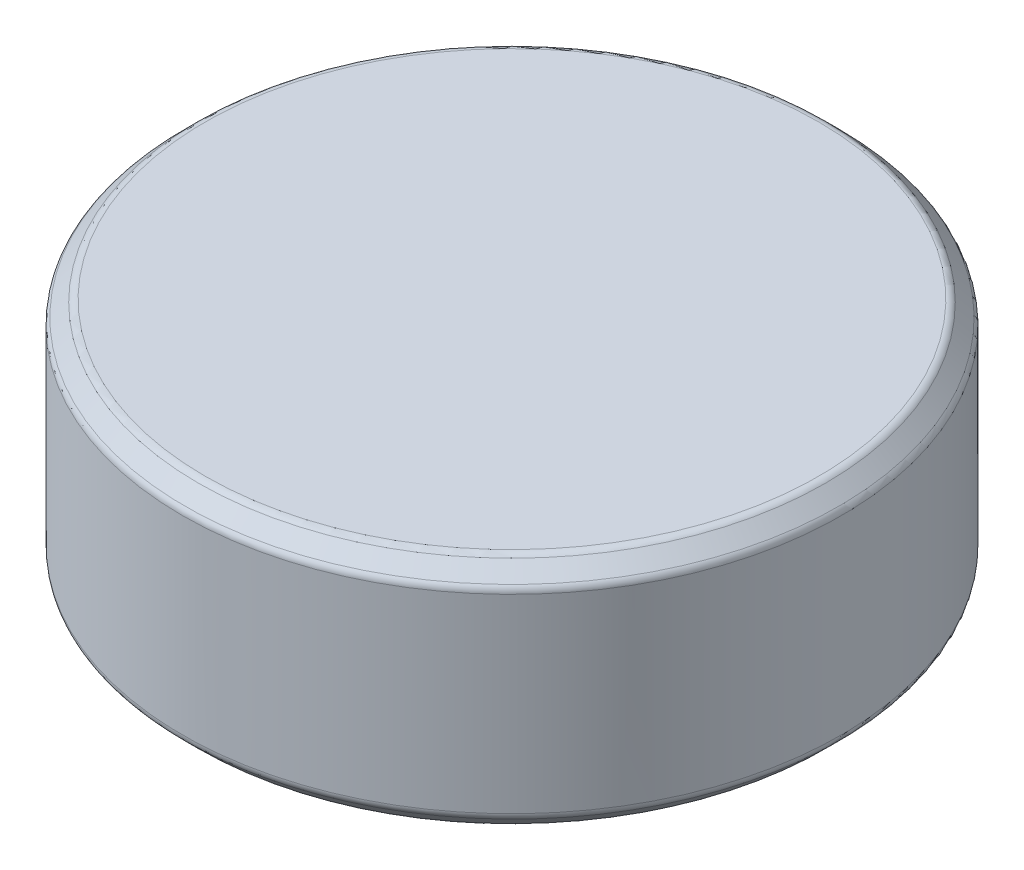
ISO-10303-21;
HEADER;
FILE_DESCRIPTION(('STEP AP214'),'2;1');
FILE_NAME('part.step','',(''),(''),'','','');
FILE_SCHEMA(('AUTOMOTIVE_DESIGN { 1 0 10303 214 1 1 1 1 }'));
ENDSEC;
DATA;
#1=APPLICATION_CONTEXT('core data for automotive mechanical design processes');
#2=APPLICATION_PROTOCOL_DEFINITION('international standard','automotive_design',2000,#1);
#3=PRODUCT_CONTEXT('',#1,'mechanical');
#4=PRODUCT('Part','Part','',(#3));
#5=PRODUCT_RELATED_PRODUCT_CATEGORY('part','',(#4));
#6=PRODUCT_DEFINITION_FORMATION('','',#4);
#7=PRODUCT_DEFINITION_CONTEXT('part definition',#1,'design');
#8=PRODUCT_DEFINITION('design','',#6,#7);
#9=PRODUCT_DEFINITION_SHAPE('','',#8);
#10=(LENGTH_UNIT() NAMED_UNIT(*) SI_UNIT(.MILLI.,.METRE.));
#11=(NAMED_UNIT(*) PLANE_ANGLE_UNIT() SI_UNIT($,.RADIAN.));
#12=(NAMED_UNIT(*) SI_UNIT($,.STERADIAN.) SOLID_ANGLE_UNIT());
#13=UNCERTAINTY_MEASURE_WITH_UNIT(LENGTH_MEASURE(1.E-05),#10,'distance_accuracy_value','');
#14=(GEOMETRIC_REPRESENTATION_CONTEXT(3) GLOBAL_UNCERTAINTY_ASSIGNED_CONTEXT((#13)) GLOBAL_UNIT_ASSIGNED_CONTEXT((#10,
#11,#12)) REPRESENTATION_CONTEXT('',''));
#15=CARTESIAN_POINT('',(0.,0.,0.));
#16=DIRECTION('',(0.,0.,1.));
#17=DIRECTION('',(1.,0.,0.));
#18=AXIS2_PLACEMENT_3D('',#15,#16,#17);
#19=CARTESIAN_POINT('',(0.,25.,0.));
#20=DIRECTION('',(0.,-1.,0.));
#21=DIRECTION('',(0.,0.,-1.));
#22=AXIS2_PLACEMENT_3D('',#19,#20,#21);
#23=CYLINDRICAL_SURFACE('',#22,35.);
#24=CARTESIAN_POINT('',(0.,2.4142135623731,0.));
#25=DIRECTION('',(0.,-1.,0.));
#26=DIRECTION('',(0.,0.,-1.));
#27=AXIS2_PLACEMENT_3D('',#24,#25,#26);
#28=CIRCLE('',#27,35.);
#29=CARTESIAN_POINT('',(0.,2.4142135623731,-35.));
#30=VERTEX_POINT('',#29);
#31=EDGE_CURVE('E46',#30,#30,#28,.F.);
#32=ORIENTED_EDGE('',*,*,#31,.T.);
#33=EDGE_LOOP('',(#32));
#34=FACE_BOUND('',#33,.T.);
#35=CARTESIAN_POINT('',(0.,22.5857864376269,0.));
#36=DIRECTION('',(0.,1.,0.));
#37=DIRECTION('',(0.,0.,1.));
#38=AXIS2_PLACEMENT_3D('',#35,#36,#37);
#39=CIRCLE('',#38,35.);
#40=CARTESIAN_POINT('',(0.,22.5857864376269,35.));
#41=VERTEX_POINT('',#40);
#42=EDGE_CURVE('E51',#41,#41,#39,.F.);
#43=ORIENTED_EDGE('',*,*,#42,.T.);
#44=EDGE_LOOP('',(#43));
#45=FACE_BOUND('',#44,.T.);
#46=ADVANCED_FACE('F31',(#34,#45),#23,.T.);
#47=CARTESIAN_POINT('',(0.,25.,0.));
#48=DIRECTION('',(0.,1.,0.));
#49=DIRECTION('',(0.,0.,1.));
#50=AXIS2_PLACEMENT_3D('',#47,#48,#49);
#51=PLANE('',#50);
#52=CARTESIAN_POINT('',(0.,25.,0.));
#53=DIRECTION('',(0.,1.,0.));
#54=DIRECTION('',(0.,0.,1.));
#55=AXIS2_PLACEMENT_3D('',#52,#53,#54);
#56=CIRCLE('',#55,32.5857864376269);
#57=CARTESIAN_POINT('',(0.,25.,32.5857864376269));
#58=VERTEX_POINT('',#57);
#59=EDGE_CURVE('E10',#58,#58,#56,.T.);
#60=ORIENTED_EDGE('',*,*,#59,.T.);
#61=EDGE_LOOP('',(#60));
#62=FACE_BOUND('',#61,.T.);
#63=ADVANCED_FACE('F83',(#62),#51,.T.);
#64=CARTESIAN_POINT('',(0.,0.,0.));
#65=DIRECTION('',(0.,1.,0.));
#66=DIRECTION('',(0.,0.,1.));
#67=AXIS2_PLACEMENT_3D('',#64,#65,#66);
#68=PLANE('',#67);
#69=CARTESIAN_POINT('',(0.,0.,0.));
#70=DIRECTION('',(0.,1.,0.));
#71=DIRECTION('',(0.,0.,1.));
#72=AXIS2_PLACEMENT_3D('',#69,#70,#71);
#73=CIRCLE('',#72,32.5857864376269);
#74=CARTESIAN_POINT('',(0.,0.,32.5857864376269));
#75=VERTEX_POINT('',#74);
#76=EDGE_CURVE('E60',#75,#75,#73,.F.);
#77=ORIENTED_EDGE('',*,*,#76,.T.);
#78=EDGE_LOOP('',(#77));
#79=FACE_BOUND('',#78,.T.);
#80=ADVANCED_FACE('F64',(#79),#68,.F.);
#81=CARTESIAN_POINT('',(0.,2.,0.));
#82=DIRECTION('',(0.,1.,0.));
#83=DIRECTION('',(0.,0.,1.));
#84=AXIS2_PLACEMENT_3D('',#81,#82,#83);
#85=CONICAL_SURFACE('',#84,35.,0.785398163397452);
#86=CARTESIAN_POINT('',(0.,0.292893218813456,0.));
#87=DIRECTION('',(0.,1.,0.));
#88=DIRECTION('',(0.,0.,1.));
#89=AXIS2_PLACEMENT_3D('',#86,#87,#88);
#90=CIRCLE('',#89,33.2928932188134);
#91=CARTESIAN_POINT('',(0.,0.292893218813456,33.2928932188134));
#92=VERTEX_POINT('',#91);
#93=EDGE_CURVE('E54',#92,#92,#90,.T.);
#94=ORIENTED_EDGE('',*,*,#93,.T.);
#95=EDGE_LOOP('',(#94));
#96=FACE_BOUND('',#95,.T.);
#97=CARTESIAN_POINT('',(0.,1.70710678118655,0.));
#98=DIRECTION('',(0.,1.,0.));
#99=DIRECTION('',(0.,0.,1.));
#100=AXIS2_PLACEMENT_3D('',#97,#98,#99);
#101=CIRCLE('',#100,34.7071067811865);
#102=CARTESIAN_POINT('',(0.,1.70710678118655,34.7071067811865));
#103=VERTEX_POINT('',#102);
#104=EDGE_CURVE('E57',#103,#103,#101,.F.);
#105=ORIENTED_EDGE('',*,*,#104,.T.);
#106=EDGE_LOOP('',(#105));
#107=FACE_BOUND('',#106,.T.);
#108=ADVANCED_FACE('F79',(#96,#107),#85,.T.);
#109=CARTESIAN_POINT('',(0.,25.,0.));
#110=DIRECTION('',(0.,-1.,0.));
#111=DIRECTION('',(0.,0.,-1.));
#112=AXIS2_PLACEMENT_3D('',#109,#110,#111);
#113=CONICAL_SURFACE('',#112,33.,0.785398163397445);
#114=CARTESIAN_POINT('',(0.,23.2928932188134,0.));
#115=DIRECTION('',(0.,-1.,0.));
#116=DIRECTION('',(0.,0.,-1.));
#117=AXIS2_PLACEMENT_3D('',#114,#115,#116);
#118=CIRCLE('',#117,34.7071067811865);
#119=CARTESIAN_POINT('',(0.,23.2928932188134,-34.7071067811865));
#120=VERTEX_POINT('',#119);
#121=EDGE_CURVE('E38',#120,#120,#118,.F.);
#122=ORIENTED_EDGE('',*,*,#121,.T.);
#123=EDGE_LOOP('',(#122));
#124=FACE_BOUND('',#123,.T.);
#125=CARTESIAN_POINT('',(0.,24.7071067811866,0.));
#126=DIRECTION('',(0.,1.,0.));
#127=DIRECTION('',(0.,0.,1.));
#128=AXIS2_PLACEMENT_3D('',#125,#126,#127);
#129=CIRCLE('',#128,33.2928932188135);
#130=CARTESIAN_POINT('',(0.,24.7071067811866,33.2928932188135));
#131=VERTEX_POINT('',#130);
#132=EDGE_CURVE('E42',#131,#131,#129,.F.);
#133=ORIENTED_EDGE('',*,*,#132,.T.);
#134=EDGE_LOOP('',(#133));
#135=FACE_BOUND('',#134,.T.);
#136=ADVANCED_FACE('F69',(#124,#135),#113,.T.);
#137=CARTESIAN_POINT('',(0.,1.,0.));
#138=DIRECTION('',(0.,1.,0.));
#139=DIRECTION('',(0.,0.,1.));
#140=AXIS2_PLACEMENT_3D('',#137,#138,#139);
#141=TOROIDAL_SURFACE('',#140,32.5857864376269,1.);
#142=ORIENTED_EDGE('',*,*,#93,.F.);
#143=EDGE_LOOP('',(#142));
#144=FACE_BOUND('',#143,.T.);
#145=ORIENTED_EDGE('',*,*,#76,.F.);
#146=EDGE_LOOP('',(#145));
#147=FACE_BOUND('',#146,.T.);
#148=ADVANCED_FACE('F66',(#144,#147),#141,.T.);
#149=CARTESIAN_POINT('',(0.,2.4142135623731,0.));
#150=DIRECTION('',(0.,-1.,0.));
#151=DIRECTION('',(0.,0.,-1.));
#152=AXIS2_PLACEMENT_3D('',#149,#150,#151);
#153=TOROIDAL_SURFACE('',#152,34.,1.);
#154=ORIENTED_EDGE('',*,*,#104,.F.);
#155=EDGE_LOOP('',(#154));
#156=FACE_BOUND('',#155,.T.);
#157=ORIENTED_EDGE('',*,*,#31,.F.);
#158=EDGE_LOOP('',(#157));
#159=FACE_BOUND('',#158,.T.);
#160=ADVANCED_FACE('F68',(#156,#159),#153,.T.);
#161=CARTESIAN_POINT('',(0.,22.5857864376269,0.));
#162=DIRECTION('',(0.,1.,0.));
#163=DIRECTION('',(0.,0.,1.));
#164=AXIS2_PLACEMENT_3D('',#161,#162,#163);
#165=TOROIDAL_SURFACE('',#164,34.,1.);
#166=ORIENTED_EDGE('',*,*,#121,.F.);
#167=EDGE_LOOP('',(#166));
#168=FACE_BOUND('',#167,.T.);
#169=ORIENTED_EDGE('',*,*,#42,.F.);
#170=EDGE_LOOP('',(#169));
#171=FACE_BOUND('',#170,.T.);
#172=ADVANCED_FACE('F76',(#168,#171),#165,.T.);
#173=CARTESIAN_POINT('',(0.,24.,0.));
#174=DIRECTION('',(0.,1.,0.));
#175=DIRECTION('',(0.,0.,1.));
#176=AXIS2_PLACEMENT_3D('',#173,#174,#175);
#177=TOROIDAL_SURFACE('',#176,32.5857864376269,1.);
#178=ORIENTED_EDGE('',*,*,#132,.F.);
#179=EDGE_LOOP('',(#178));
#180=FACE_BOUND('',#179,.T.);
#181=ORIENTED_EDGE('',*,*,#59,.F.);
#182=EDGE_LOOP('',(#181));
#183=FACE_BOUND('',#182,.T.);
#184=ADVANCED_FACE('F33',(#180,#183),#177,.T.);
#185=CLOSED_SHELL('',(#46,#63,#80,#108,#136,#148,#160,#172,#184));
#186=MANIFOLD_SOLID_BREP('B2',#185);
#187=ADVANCED_BREP_SHAPE_REPRESENTATION('',(#18,#186),#14);
#188=SHAPE_DEFINITION_REPRESENTATION(#9,#187);
ENDSEC;
END-ISO-10303-21;
